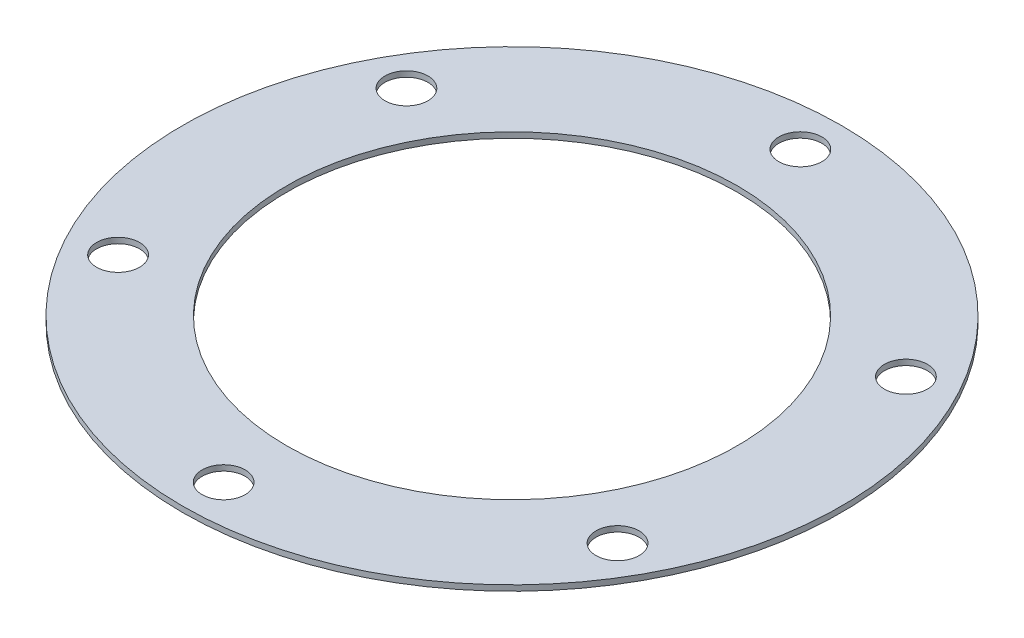
ISO-10303-21;
HEADER;
FILE_DESCRIPTION(('STEP AP214'),'2;1');
FILE_NAME('part.step','',(''),(''),'','','');
FILE_SCHEMA(('AUTOMOTIVE_DESIGN { 1 0 10303 214 1 1 1 1 }'));
ENDSEC;
DATA;
#1=APPLICATION_CONTEXT('core data for automotive mechanical design processes');
#2=APPLICATION_PROTOCOL_DEFINITION('international standard','automotive_design',2000,#1);
#3=PRODUCT_CONTEXT('',#1,'mechanical');
#4=PRODUCT('Part','Part','',(#3));
#5=PRODUCT_RELATED_PRODUCT_CATEGORY('part','',(#4));
#6=PRODUCT_DEFINITION_FORMATION('','',#4);
#7=PRODUCT_DEFINITION_CONTEXT('part definition',#1,'design');
#8=PRODUCT_DEFINITION('design','',#6,#7);
#9=PRODUCT_DEFINITION_SHAPE('','',#8);
#10=(LENGTH_UNIT() NAMED_UNIT(*) SI_UNIT(.MILLI.,.METRE.));
#11=(NAMED_UNIT(*) PLANE_ANGLE_UNIT() SI_UNIT($,.RADIAN.));
#12=(NAMED_UNIT(*) SI_UNIT($,.STERADIAN.) SOLID_ANGLE_UNIT());
#13=UNCERTAINTY_MEASURE_WITH_UNIT(LENGTH_MEASURE(1.E-05),#10,'distance_accuracy_value','');
#14=(GEOMETRIC_REPRESENTATION_CONTEXT(3) GLOBAL_UNCERTAINTY_ASSIGNED_CONTEXT((#13)) GLOBAL_UNIT_ASSIGNED_CONTEXT((#10,
#11,#12)) REPRESENTATION_CONTEXT('',''));
#15=CARTESIAN_POINT('',(0.,0.,0.));
#16=DIRECTION('',(0.,0.,1.));
#17=DIRECTION('',(1.,0.,0.));
#18=AXIS2_PLACEMENT_3D('',#15,#16,#17);
#19=CARTESIAN_POINT('',(0.,0.8636,0.));
#20=DIRECTION('',(0.,-1.,0.));
#21=DIRECTION('',(0.,0.,-1.));
#22=AXIS2_PLACEMENT_3D('',#19,#20,#21);
#23=CYLINDRICAL_SURFACE('',#22,34.7272);
#24=CARTESIAN_POINT('',(0.,0.8636,0.));
#25=DIRECTION('',(0.,1.,0.));
#26=DIRECTION('',(0.,0.,1.));
#27=AXIS2_PLACEMENT_3D('',#24,#25,#26);
#28=CIRCLE('',#27,34.7272);
#29=CARTESIAN_POINT('',(0.,0.8636,34.7272));
#30=VERTEX_POINT('',#29);
#31=EDGE_CURVE('E50',#30,#30,#28,.T.);
#32=ORIENTED_EDGE('',*,*,#31,.T.);
#33=EDGE_LOOP('',(#32));
#34=FACE_BOUND('',#33,.T.);
#35=CARTESIAN_POINT('',(0.,0.,0.));
#36=DIRECTION('',(0.,1.,0.));
#37=DIRECTION('',(0.,0.,1.));
#38=AXIS2_PLACEMENT_3D('',#35,#36,#37);
#39=CIRCLE('',#38,34.7272);
#40=CARTESIAN_POINT('',(0.,0.,34.7272));
#41=VERTEX_POINT('',#40);
#42=EDGE_CURVE('E83',#41,#41,#39,.T.);
#43=ORIENTED_EDGE('',*,*,#42,.F.);
#44=EDGE_LOOP('',(#43));
#45=FACE_BOUND('',#44,.T.);
#46=ADVANCED_FACE('F41',(#34,#45),#23,.F.);
#47=CARTESIAN_POINT('',(0.,0.8636,-44.45));
#48=DIRECTION('',(0.,-1.,0.));
#49=DIRECTION('',(0.,0.,-1.));
#50=AXIS2_PLACEMENT_3D('',#47,#48,#49);
#51=CYLINDRICAL_SURFACE('',#50,3.3147);
#52=CARTESIAN_POINT('',(0.,0.8636,-44.45));
#53=DIRECTION('',(0.,1.,0.));
#54=DIRECTION('',(0.,0.,1.));
#55=AXIS2_PLACEMENT_3D('',#52,#53,#54);
#56=CIRCLE('',#55,3.3147);
#57=CARTESIAN_POINT('',(0.,0.8636,-41.1353));
#58=VERTEX_POINT('',#57);
#59=EDGE_CURVE('E56',#58,#58,#56,.T.);
#60=ORIENTED_EDGE('',*,*,#59,.T.);
#61=EDGE_LOOP('',(#60));
#62=FACE_BOUND('',#61,.T.);
#63=CARTESIAN_POINT('',(0.,0.,-44.45));
#64=DIRECTION('',(0.,1.,0.));
#65=DIRECTION('',(0.,0.,1.));
#66=AXIS2_PLACEMENT_3D('',#63,#64,#65);
#67=CIRCLE('',#66,3.3147);
#68=CARTESIAN_POINT('',(0.,0.,-41.1353));
#69=VERTEX_POINT('',#68);
#70=EDGE_CURVE('E80',#69,#69,#67,.T.);
#71=ORIENTED_EDGE('',*,*,#70,.F.);
#72=EDGE_LOOP('',(#71));
#73=FACE_BOUND('',#72,.T.);
#74=ADVANCED_FACE('F118',(#62,#73),#51,.F.);
#75=CARTESIAN_POINT('',(38.4948291982195,0.8636,-22.2250000000022));
#76=DIRECTION('',(0.,-1.,0.));
#77=DIRECTION('',(0.,0.,-1.));
#78=AXIS2_PLACEMENT_3D('',#75,#76,#77);
#79=CYLINDRICAL_SURFACE('',#78,3.31470000000068);
#80=CARTESIAN_POINT('',(38.4948291982195,0.8636,-22.2250000000022));
#81=DIRECTION('',(0.,1.,0.));
#82=DIRECTION('',(0.,0.,1.));
#83=AXIS2_PLACEMENT_3D('',#80,#81,#82);
#84=CIRCLE('',#83,3.31470000000068);
#85=CARTESIAN_POINT('',(38.4948291982195,0.8636,-18.9103000000015));
#86=VERTEX_POINT('',#85);
#87=EDGE_CURVE('E111',#86,#86,#84,.T.);
#88=ORIENTED_EDGE('',*,*,#87,.T.);
#89=EDGE_LOOP('',(#88));
#90=FACE_BOUND('',#89,.T.);
#91=CARTESIAN_POINT('',(38.4948291982195,0.,-22.2250000000022));
#92=DIRECTION('',(0.,1.,0.));
#93=DIRECTION('',(0.,0.,1.));
#94=AXIS2_PLACEMENT_3D('',#91,#92,#93);
#95=CIRCLE('',#94,3.31470000000068);
#96=CARTESIAN_POINT('',(38.4948291982195,0.,-18.9103000000015));
#97=VERTEX_POINT('',#96);
#98=EDGE_CURVE('E76',#97,#97,#95,.T.);
#99=ORIENTED_EDGE('',*,*,#98,.F.);
#100=EDGE_LOOP('',(#99));
#101=FACE_BOUND('',#100,.T.);
#102=ADVANCED_FACE('F136',(#90,#101),#79,.F.);
#103=CARTESIAN_POINT('',(38.4948291982221,0.8636,22.2249999999978));
#104=DIRECTION('',(0.,-1.,0.));
#105=DIRECTION('',(0.,0.,-1.));
#106=AXIS2_PLACEMENT_3D('',#103,#104,#105);
#107=CYLINDRICAL_SURFACE('',#106,3.31470000000319);
#108=CARTESIAN_POINT('',(38.4948291982221,0.8636,22.2249999999978));
#109=DIRECTION('',(0.,1.,0.));
#110=DIRECTION('',(0.,0.,1.));
#111=AXIS2_PLACEMENT_3D('',#108,#109,#110);
#112=CIRCLE('',#111,3.31470000000319);
#113=CARTESIAN_POINT('',(38.4948291982221,0.8636,25.539700000001));
#114=VERTEX_POINT('',#113);
#115=EDGE_CURVE('E107',#114,#114,#112,.T.);
#116=ORIENTED_EDGE('',*,*,#115,.T.);
#117=EDGE_LOOP('',(#116));
#118=FACE_BOUND('',#117,.T.);
#119=CARTESIAN_POINT('',(38.4948291982221,0.,22.2249999999978));
#120=DIRECTION('',(0.,1.,0.));
#121=DIRECTION('',(0.,0.,1.));
#122=AXIS2_PLACEMENT_3D('',#119,#120,#121);
#123=CIRCLE('',#122,3.31470000000319);
#124=CARTESIAN_POINT('',(38.4948291982221,0.,25.539700000001));
#125=VERTEX_POINT('',#124);
#126=EDGE_CURVE('E72',#125,#125,#123,.T.);
#127=ORIENTED_EDGE('',*,*,#126,.F.);
#128=EDGE_LOOP('',(#127));
#129=FACE_BOUND('',#128,.T.);
#130=ADVANCED_FACE('F143',(#118,#129),#107,.F.);
#131=CARTESIAN_POINT('',(5.0370492716592E-12,0.8636,44.45));
#132=DIRECTION('',(0.,-1.,0.));
#133=DIRECTION('',(0.,0.,-1.));
#134=AXIS2_PLACEMENT_3D('',#131,#132,#133);
#135=CYLINDRICAL_SURFACE('',#134,3.31470000000511);
#136=CARTESIAN_POINT('',(5.0370492716592E-12,0.8636,44.45));
#137=DIRECTION('',(0.,1.,0.));
#138=DIRECTION('',(0.,0.,1.));
#139=AXIS2_PLACEMENT_3D('',#136,#137,#138);
#140=CIRCLE('',#139,3.31470000000511);
#141=CARTESIAN_POINT('',(5.0370492716592E-12,0.8636,47.7647000000051));
#142=VERTEX_POINT('',#141);
#143=EDGE_CURVE('E101',#142,#142,#140,.T.);
#144=ORIENTED_EDGE('',*,*,#143,.T.);
#145=EDGE_LOOP('',(#144));
#146=FACE_BOUND('',#145,.T.);
#147=CARTESIAN_POINT('',(5.0370492716592E-12,0.,44.45));
#148=DIRECTION('',(0.,1.,0.));
#149=DIRECTION('',(0.,0.,1.));
#150=AXIS2_PLACEMENT_3D('',#147,#148,#149);
#151=CIRCLE('',#150,3.31470000000511);
#152=CARTESIAN_POINT('',(5.0370492716592E-12,0.,47.7647000000051));
#153=VERTEX_POINT('',#152);
#154=EDGE_CURVE('E68',#153,#153,#151,.T.);
#155=ORIENTED_EDGE('',*,*,#154,.F.);
#156=EDGE_LOOP('',(#155));
#157=FACE_BOUND('',#156,.T.);
#158=ADVANCED_FACE('F147',(#146,#157),#135,.F.);
#159=CARTESIAN_POINT('',(-38.4948291982145,0.8636,22.2250000000022));
#160=DIRECTION('',(0.,-1.,0.));
#161=DIRECTION('',(0.,0.,-1.));
#162=AXIS2_PLACEMENT_3D('',#159,#160,#161);
#163=CYLINDRICAL_SURFACE('',#162,3.31470000000466);
#164=CARTESIAN_POINT('',(-38.4948291982145,0.8636,22.2250000000022));
#165=DIRECTION('',(0.,1.,0.));
#166=DIRECTION('',(0.,0.,1.));
#167=AXIS2_PLACEMENT_3D('',#164,#165,#166);
#168=CIRCLE('',#167,3.31470000000466);
#169=CARTESIAN_POINT('',(-38.4948291982145,0.8636,25.5397000000069));
#170=VERTEX_POINT('',#169);
#171=EDGE_CURVE('E95',#170,#170,#168,.T.);
#172=ORIENTED_EDGE('',*,*,#171,.T.);
#173=EDGE_LOOP('',(#172));
#174=FACE_BOUND('',#173,.T.);
#175=CARTESIAN_POINT('',(-38.4948291982145,0.,22.2250000000022));
#176=DIRECTION('',(0.,1.,0.));
#177=DIRECTION('',(0.,0.,1.));
#178=AXIS2_PLACEMENT_3D('',#175,#176,#177);
#179=CIRCLE('',#178,3.31470000000466);
#180=CARTESIAN_POINT('',(-38.4948291982145,0.,25.5397000000069));
#181=VERTEX_POINT('',#180);
#182=EDGE_CURVE('E64',#181,#181,#179,.T.);
#183=ORIENTED_EDGE('',*,*,#182,.F.);
#184=EDGE_LOOP('',(#183));
#185=FACE_BOUND('',#184,.T.);
#186=ADVANCED_FACE('F150',(#174,#185),#163,.F.);
#187=CARTESIAN_POINT('',(-38.4948291982171,0.8636,-22.2249999999978));
#188=DIRECTION('',(0.,-1.,0.));
#189=DIRECTION('',(0.,0.,-1.));
#190=AXIS2_PLACEMENT_3D('',#187,#188,#189);
#191=CYLINDRICAL_SURFACE('',#190,3.31470000000237);
#192=CARTESIAN_POINT('',(-38.4948291982171,0.8636,-22.2249999999978));
#193=DIRECTION('',(0.,1.,0.));
#194=DIRECTION('',(0.,0.,1.));
#195=AXIS2_PLACEMENT_3D('',#192,#193,#194);
#196=CIRCLE('',#195,3.31470000000237);
#197=CARTESIAN_POINT('',(-38.4948291982171,0.8636,-18.9102999999954));
#198=VERTEX_POINT('',#197);
#199=EDGE_CURVE('E90',#198,#198,#196,.T.);
#200=ORIENTED_EDGE('',*,*,#199,.T.);
#201=EDGE_LOOP('',(#200));
#202=FACE_BOUND('',#201,.T.);
#203=CARTESIAN_POINT('',(-38.4948291982171,0.,-22.2249999999978));
#204=DIRECTION('',(0.,1.,0.));
#205=DIRECTION('',(0.,0.,1.));
#206=AXIS2_PLACEMENT_3D('',#203,#204,#205);
#207=CIRCLE('',#206,3.31470000000237);
#208=CARTESIAN_POINT('',(-38.4948291982171,0.,-18.9102999999954));
#209=VERTEX_POINT('',#208);
#210=EDGE_CURVE('E60',#209,#209,#207,.T.);
#211=ORIENTED_EDGE('',*,*,#210,.F.);
#212=EDGE_LOOP('',(#211));
#213=FACE_BOUND('',#212,.T.);
#214=ADVANCED_FACE('F43',(#202,#213),#191,.F.);
#215=CARTESIAN_POINT('',(0.,0.8636,0.));
#216=DIRECTION('',(0.,-1.,0.));
#217=DIRECTION('',(0.,0.,-1.));
#218=AXIS2_PLACEMENT_3D('',#215,#216,#217);
#219=CYLINDRICAL_SURFACE('',#218,50.8);
#220=CARTESIAN_POINT('',(0.,0.8636,0.));
#221=DIRECTION('',(0.,1.,0.));
#222=DIRECTION('',(0.,0.,1.));
#223=AXIS2_PLACEMENT_3D('',#220,#221,#222);
#224=CIRCLE('',#223,50.8);
#225=CARTESIAN_POINT('',(0.,0.8636,50.8));
#226=VERTEX_POINT('',#225);
#227=EDGE_CURVE('E10',#226,#226,#224,.T.);
#228=ORIENTED_EDGE('',*,*,#227,.F.);
#229=EDGE_LOOP('',(#228));
#230=FACE_BOUND('',#229,.T.);
#231=CARTESIAN_POINT('',(0.,0.,0.));
#232=DIRECTION('',(0.,1.,0.));
#233=DIRECTION('',(0.,0.,1.));
#234=AXIS2_PLACEMENT_3D('',#231,#232,#233);
#235=CIRCLE('',#234,50.8);
#236=CARTESIAN_POINT('',(0.,0.,50.8));
#237=VERTEX_POINT('',#236);
#238=EDGE_CURVE('E45',#237,#237,#235,.T.);
#239=ORIENTED_EDGE('',*,*,#238,.T.);
#240=EDGE_LOOP('',(#239));
#241=FACE_BOUND('',#240,.T.);
#242=ADVANCED_FACE('F125',(#230,#241),#219,.T.);
#243=CARTESIAN_POINT('',(0.,0.8636,0.));
#244=DIRECTION('',(0.,1.,0.));
#245=DIRECTION('',(0.,0.,1.));
#246=AXIS2_PLACEMENT_3D('',#243,#244,#245);
#247=PLANE('',#246);
#248=ORIENTED_EDGE('',*,*,#199,.F.);
#249=EDGE_LOOP('',(#248));
#250=FACE_BOUND('',#249,.T.);
#251=ORIENTED_EDGE('',*,*,#171,.F.);
#252=EDGE_LOOP('',(#251));
#253=FACE_BOUND('',#252,.T.);
#254=ORIENTED_EDGE('',*,*,#143,.F.);
#255=EDGE_LOOP('',(#254));
#256=FACE_BOUND('',#255,.T.);
#257=ORIENTED_EDGE('',*,*,#115,.F.);
#258=EDGE_LOOP('',(#257));
#259=FACE_BOUND('',#258,.T.);
#260=ORIENTED_EDGE('',*,*,#87,.F.);
#261=EDGE_LOOP('',(#260));
#262=FACE_BOUND('',#261,.T.);
#263=ORIENTED_EDGE('',*,*,#59,.F.);
#264=EDGE_LOOP('',(#263));
#265=FACE_BOUND('',#264,.T.);
#266=ORIENTED_EDGE('',*,*,#31,.F.);
#267=EDGE_LOOP('',(#266));
#268=FACE_BOUND('',#267,.T.);
#269=ORIENTED_EDGE('',*,*,#227,.T.);
#270=EDGE_LOOP('',(#269));
#271=FACE_BOUND('',#270,.T.);
#272=ADVANCED_FACE('F121',(#250,#253,#256,#259,#262,#265,#268,#271),#247,.T.);
#273=CARTESIAN_POINT('',(0.,0.,0.));
#274=DIRECTION('',(0.,1.,0.));
#275=DIRECTION('',(0.,0.,1.));
#276=AXIS2_PLACEMENT_3D('',#273,#274,#275);
#277=PLANE('',#276);
#278=ORIENTED_EDGE('',*,*,#210,.T.);
#279=EDGE_LOOP('',(#278));
#280=FACE_BOUND('',#279,.T.);
#281=ORIENTED_EDGE('',*,*,#182,.T.);
#282=EDGE_LOOP('',(#281));
#283=FACE_BOUND('',#282,.T.);
#284=ORIENTED_EDGE('',*,*,#154,.T.);
#285=EDGE_LOOP('',(#284));
#286=FACE_BOUND('',#285,.T.);
#287=ORIENTED_EDGE('',*,*,#126,.T.);
#288=EDGE_LOOP('',(#287));
#289=FACE_BOUND('',#288,.T.);
#290=ORIENTED_EDGE('',*,*,#98,.T.);
#291=EDGE_LOOP('',(#290));
#292=FACE_BOUND('',#291,.T.);
#293=ORIENTED_EDGE('',*,*,#70,.T.);
#294=EDGE_LOOP('',(#293));
#295=FACE_BOUND('',#294,.T.);
#296=ORIENTED_EDGE('',*,*,#42,.T.);
#297=EDGE_LOOP('',(#296));
#298=FACE_BOUND('',#297,.T.);
#299=ORIENTED_EDGE('',*,*,#238,.F.);
#300=EDGE_LOOP('',(#299));
#301=FACE_BOUND('',#300,.T.);
#302=ADVANCED_FACE('F124',(#280,#283,#286,#289,#292,#295,#298,#301),#277,.F.);
#303=CLOSED_SHELL('',(#46,#74,#102,#130,#158,#186,#214,#242,#272,#302));
#304=MANIFOLD_SOLID_BREP('B2',#303);
#305=ADVANCED_BREP_SHAPE_REPRESENTATION('',(#18,#304),#14);
#306=SHAPE_DEFINITION_REPRESENTATION(#9,#305);
ENDSEC;
END-ISO-10303-21;
